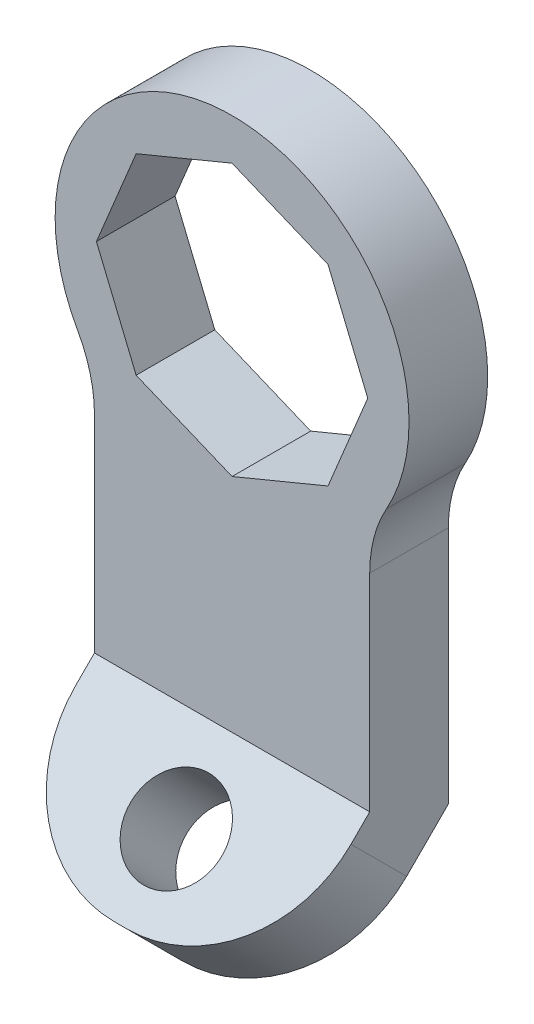
ISO-10303-21;
HEADER;
FILE_DESCRIPTION(('STEP AP214'),'2;1');
FILE_NAME('part.step','',(''),(''),'','','');
FILE_SCHEMA(('AUTOMOTIVE_DESIGN { 1 0 10303 214 1 1 1 1 }'));
ENDSEC;
DATA;
#1=APPLICATION_CONTEXT('core data for automotive mechanical design processes');
#2=APPLICATION_PROTOCOL_DEFINITION('international standard','automotive_design',2000,#1);
#3=PRODUCT_CONTEXT('',#1,'mechanical');
#4=PRODUCT('Part','Part','',(#3));
#5=PRODUCT_RELATED_PRODUCT_CATEGORY('part','',(#4));
#6=PRODUCT_DEFINITION_FORMATION('','',#4);
#7=PRODUCT_DEFINITION_CONTEXT('part definition',#1,'design');
#8=PRODUCT_DEFINITION('design','',#6,#7);
#9=PRODUCT_DEFINITION_SHAPE('','',#8);
#10=(LENGTH_UNIT() NAMED_UNIT(*) SI_UNIT(.MILLI.,.METRE.));
#11=(NAMED_UNIT(*) PLANE_ANGLE_UNIT() SI_UNIT($,.RADIAN.));
#12=(NAMED_UNIT(*) SI_UNIT($,.STERADIAN.) SOLID_ANGLE_UNIT());
#13=UNCERTAINTY_MEASURE_WITH_UNIT(LENGTH_MEASURE(1.E-05),#10,'distance_accuracy_value','');
#14=(GEOMETRIC_REPRESENTATION_CONTEXT(3) GLOBAL_UNCERTAINTY_ASSIGNED_CONTEXT((#13)) GLOBAL_UNIT_ASSIGNED_CONTEXT((#10,
#11,#12)) REPRESENTATION_CONTEXT('',''));
#15=CARTESIAN_POINT('',(0.,0.,0.));
#16=DIRECTION('',(0.,0.,1.));
#17=DIRECTION('',(1.,0.,0.));
#18=AXIS2_PLACEMENT_3D('',#15,#16,#17);
#19=CARTESIAN_POINT('',(0.,0.,0.));
#20=DIRECTION('',(0.,0.,1.));
#21=DIRECTION('',(1.,0.,0.));
#22=AXIS2_PLACEMENT_3D('',#19,#20,#21);
#23=PLANE('',#22);
#24=DIRECTION('',(0.38268343236509,-0.923879532511287,0.));
#25=VECTOR('',#24,1.);
#26=CARTESIAN_POINT('',(7.31855518528077,7.31855518528077,0.));
#27=LINE('',#26,#25);
#28=CARTESIAN_POINT('',(7.31855518528077,7.31855518528077,0.));
#29=VERTEX_POINT('',#28);
#30=CARTESIAN_POINT('',(10.35,0.,0.));
#31=VERTEX_POINT('',#30);
#32=EDGE_CURVE('E218',#29,#31,#27,.T.);
#33=ORIENTED_EDGE('',*,*,#32,.F.);
#34=DIRECTION('',(0.923879532511287,-0.38268343236509,0.));
#35=VECTOR('',#34,1.);
#36=CARTESIAN_POINT('',(0.,10.35,0.));
#37=LINE('',#36,#35);
#38=CARTESIAN_POINT('',(0.,10.35,0.));
#39=VERTEX_POINT('',#38);
#40=EDGE_CURVE('E219',#39,#29,#37,.T.);
#41=ORIENTED_EDGE('',*,*,#40,.F.);
#42=DIRECTION('',(0.923879532511287,0.38268343236509,0.));
#43=VECTOR('',#42,1.);
#44=CARTESIAN_POINT('',(-7.31855518528077,7.31855518528077,0.));
#45=LINE('',#44,#43);
#46=CARTESIAN_POINT('',(-7.31855518528077,7.31855518528077,0.));
#47=VERTEX_POINT('',#46);
#48=EDGE_CURVE('E232',#47,#39,#45,.T.);
#49=ORIENTED_EDGE('',*,*,#48,.F.);
#50=DIRECTION('',(0.38268343236509,0.923879532511287,0.));
#51=VECTOR('',#50,1.);
#52=CARTESIAN_POINT('',(-10.35,0.,0.));
#53=LINE('',#52,#51);
#54=CARTESIAN_POINT('',(-10.35,0.,0.));
#55=VERTEX_POINT('',#54);
#56=EDGE_CURVE('E272',#55,#47,#53,.T.);
#57=ORIENTED_EDGE('',*,*,#56,.F.);
#58=DIRECTION('',(-0.38268343236509,0.923879532511287,0.));
#59=VECTOR('',#58,1.);
#60=CARTESIAN_POINT('',(-7.31855518528077,-7.31855518528077,0.));
#61=LINE('',#60,#59);
#62=CARTESIAN_POINT('',(-7.31855518528077,-7.31855518528077,0.));
#63=VERTEX_POINT('',#62);
#64=EDGE_CURVE('E266',#63,#55,#61,.T.);
#65=ORIENTED_EDGE('',*,*,#64,.F.);
#66=DIRECTION('',(-0.923879532511287,0.38268343236509,0.));
#67=VECTOR('',#66,1.);
#68=CARTESIAN_POINT('',(0.,-10.35,0.));
#69=LINE('',#68,#67);
#70=CARTESIAN_POINT('',(0.,-10.35,0.));
#71=VERTEX_POINT('',#70);
#72=EDGE_CURVE('E263',#71,#63,#69,.T.);
#73=ORIENTED_EDGE('',*,*,#72,.F.);
#74=DIRECTION('',(-0.923879532511287,-0.38268343236509,0.));
#75=VECTOR('',#74,1.);
#76=CARTESIAN_POINT('',(7.31855518528077,-7.31855518528077,0.));
#77=LINE('',#76,#75);
#78=CARTESIAN_POINT('',(7.31855518528077,-7.31855518528077,0.));
#79=VERTEX_POINT('',#78);
#80=EDGE_CURVE('E265',#79,#71,#77,.T.);
#81=ORIENTED_EDGE('',*,*,#80,.F.);
#82=DIRECTION('',(-0.38268343236509,-0.923879532511287,0.));
#83=VECTOR('',#82,1.);
#84=CARTESIAN_POINT('',(10.35,0.,0.));
#85=LINE('',#84,#83);
#86=EDGE_CURVE('E256',#31,#79,#85,.T.);
#87=ORIENTED_EDGE('',*,*,#86,.F.);
#88=EDGE_LOOP('',(#33,#41,#49,#57,#65,#73,#81,#87));
#89=FACE_BOUND('',#88,.T.);
#90=DIRECTION('',(1.,0.,0.));
#91=VECTOR('',#90,1.);
#92=CARTESIAN_POINT('',(-13.5,-29.7426406871192,0.));
#93=LINE('',#92,#91);
#94=CARTESIAN_POINT('',(-10.5,-29.7426406871192,0.));
#95=VERTEX_POINT('',#94);
#96=CARTESIAN_POINT('',(10.5,-29.7426406871192,0.));
#97=VERTEX_POINT('',#96);
#98=EDGE_CURVE('E198',#95,#97,#93,.T.);
#99=ORIENTED_EDGE('',*,*,#98,.F.);
#100=DIRECTION('',(0.,1.,0.));
#101=VECTOR('',#100,1.);
#102=CARTESIAN_POINT('',(-10.5,0.,0.));
#103=LINE('',#102,#101);
#104=CARTESIAN_POINT('',(-10.5,-11.4891252930761,0.));
#105=VERTEX_POINT('',#104);
#106=EDGE_CURVE('E209',#95,#105,#103,.T.);
#107=ORIENTED_EDGE('',*,*,#106,.T.);
#108=CARTESIAN_POINT('',(-20.5,-11.4891252930761,0.));
#109=DIRECTION('',(0.,0.,1.));
#110=DIRECTION('',(1.,0.,0.));
#111=AXIS2_PLACEMENT_3D('',#108,#109,#110);
#112=CIRCLE('',#111,10.);
#113=CARTESIAN_POINT('',(-11.7765957446809,-6.60013580666071,0.));
#114=VERTEX_POINT('',#113);
#115=EDGE_CURVE('E323',#105,#114,#112,.T.);
#116=ORIENTED_EDGE('',*,*,#115,.T.);
#117=CARTESIAN_POINT('',(0.,0.,0.));
#118=DIRECTION('',(0.,0.,1.));
#119=DIRECTION('',(1.,0.,0.));
#120=AXIS2_PLACEMENT_3D('',#117,#118,#119);
#121=CIRCLE('',#120,13.5);
#122=CARTESIAN_POINT('',(11.7765957446809,-6.60013580666071,0.));
#123=VERTEX_POINT('',#122);
#124=EDGE_CURVE('E279',#123,#114,#121,.T.);
#125=ORIENTED_EDGE('',*,*,#124,.F.);
#126=CARTESIAN_POINT('',(20.5,-11.4891252930761,0.));
#127=DIRECTION('',(0.,0.,1.));
#128=DIRECTION('',(1.,0.,0.));
#129=AXIS2_PLACEMENT_3D('',#126,#127,#128);
#130=CIRCLE('',#129,10.);
#131=CARTESIAN_POINT('',(10.5,-11.4891252930761,0.));
#132=VERTEX_POINT('',#131);
#133=EDGE_CURVE('E12',#123,#132,#130,.T.);
#134=ORIENTED_EDGE('',*,*,#133,.T.);
#135=DIRECTION('',(0.,1.,0.));
#136=VECTOR('',#135,1.);
#137=CARTESIAN_POINT('',(10.5,0.,0.));
#138=LINE('',#137,#136);
#139=EDGE_CURVE('E212',#97,#132,#138,.T.);
#140=ORIENTED_EDGE('',*,*,#139,.F.);
#141=EDGE_LOOP('',(#99,#107,#116,#125,#134,#140));
#142=FACE_BOUND('',#141,.T.);
#143=ADVANCED_FACE('F68',(#89,#142),#23,.F.);
#144=CARTESIAN_POINT('',(-10.5,0.,0.));
#145=DIRECTION('',(1.,0.,0.));
#146=DIRECTION('',(0.,1.,0.));
#147=AXIS2_PLACEMENT_3D('',#144,#145,#146);
#148=PLANE('',#147);
#149=DIRECTION('',(0.,0.707106781186551,-0.707106781186544));
#150=VECTOR('',#149,1.);
#151=CARTESIAN_POINT('',(-10.5,-40.,10.2573593128807));
#152=LINE('',#151,#150);
#153=CARTESIAN_POINT('',(-10.5,-32.9289321881345,3.18629150101525));
#154=VERTEX_POINT('',#153);
#155=EDGE_CURVE('E193',#154,#95,#152,.T.);
#156=ORIENTED_EDGE('',*,*,#155,.F.);
#157=DIRECTION('',(0.,-0.707106781186545,-0.707106781186551));
#158=VECTOR('',#157,1.);
#159=CARTESIAN_POINT('',(-10.5,-28.6862915010152,7.42893218813455));
#160=LINE('',#159,#158);
#161=CARTESIAN_POINT('',(-10.5,-28.6862915010152,7.42893218813455));
#162=VERTEX_POINT('',#161);
#163=EDGE_CURVE('E310',#154,#162,#160,.F.);
#164=ORIENTED_EDGE('',*,*,#163,.T.);
#165=DIRECTION('',(0.,-0.707106781186551,0.707106781186544));
#166=VECTOR('',#165,1.);
#167=CARTESIAN_POINT('',(-10.5,-27.2573593128806,6.));
#168=LINE('',#167,#166);
#169=CARTESIAN_POINT('',(-10.5,-27.2573593128806,6.));
#170=VERTEX_POINT('',#169);
#171=EDGE_CURVE('E207',#170,#162,#168,.T.);
#172=ORIENTED_EDGE('',*,*,#171,.F.);
#173=DIRECTION('',(0.,1.,0.));
#174=VECTOR('',#173,1.);
#175=CARTESIAN_POINT('',(-10.5,0.,6.));
#176=LINE('',#175,#174);
#177=CARTESIAN_POINT('',(-10.5,-11.4891252930761,6.));
#178=VERTEX_POINT('',#177);
#179=EDGE_CURVE('E225',#170,#178,#176,.T.);
#180=ORIENTED_EDGE('',*,*,#179,.T.);
#181=DIRECTION('',(0.,0.,1.));
#182=VECTOR('',#181,1.);
#183=CARTESIAN_POINT('',(-10.5,-11.4891252930761,0.));
#184=LINE('',#183,#182);
#185=EDGE_CURVE('E220',#178,#105,#184,.F.);
#186=ORIENTED_EDGE('',*,*,#185,.T.);
#187=ORIENTED_EDGE('',*,*,#106,.F.);
#188=EDGE_LOOP('',(#156,#164,#172,#180,#186,#187));
#189=FACE_BOUND('',#188,.T.);
#190=ADVANCED_FACE('F211',(#189),#148,.F.);
#191=CARTESIAN_POINT('',(10.5,0.,0.));
#192=DIRECTION('',(1.,0.,0.));
#193=DIRECTION('',(0.,1.,0.));
#194=AXIS2_PLACEMENT_3D('',#191,#192,#193);
#195=PLANE('',#194);
#196=ORIENTED_EDGE('',*,*,#139,.T.);
#197=DIRECTION('',(0.,0.,-1.));
#198=VECTOR('',#197,1.);
#199=CARTESIAN_POINT('',(10.5,-11.4891252930761,0.));
#200=LINE('',#199,#198);
#201=CARTESIAN_POINT('',(10.5,-11.4891252930761,6.));
#202=VERTEX_POINT('',#201);
#203=EDGE_CURVE('E322',#132,#202,#200,.F.);
#204=ORIENTED_EDGE('',*,*,#203,.T.);
#205=DIRECTION('',(0.,1.,0.));
#206=VECTOR('',#205,1.);
#207=CARTESIAN_POINT('',(10.5,0.,6.));
#208=LINE('',#207,#206);
#209=CARTESIAN_POINT('',(10.5,-27.2573593128806,6.));
#210=VERTEX_POINT('',#209);
#211=EDGE_CURVE('E228',#210,#202,#208,.T.);
#212=ORIENTED_EDGE('',*,*,#211,.F.);
#213=DIRECTION('',(0.,-0.707106781186551,0.707106781186544));
#214=VECTOR('',#213,1.);
#215=CARTESIAN_POINT('',(10.5,-27.2573593128806,6.));
#216=LINE('',#215,#214);
#217=CARTESIAN_POINT('',(10.5,-28.6862915010152,7.42893218813456));
#218=VERTEX_POINT('',#217);
#219=EDGE_CURVE('E342',#210,#218,#216,.T.);
#220=ORIENTED_EDGE('',*,*,#219,.T.);
#221=DIRECTION('',(0.,-0.707106781186545,-0.707106781186551));
#222=VECTOR('',#221,1.);
#223=CARTESIAN_POINT('',(10.5,-18.057611844575,18.0576118445749));
#224=LINE('',#223,#222);
#225=CARTESIAN_POINT('',(10.5,-32.9289321881345,3.18629150101525));
#226=VERTEX_POINT('',#225);
#227=EDGE_CURVE('E319',#218,#226,#224,.T.);
#228=ORIENTED_EDGE('',*,*,#227,.T.);
#229=DIRECTION('',(0.,0.707106781186551,-0.707106781186544));
#230=VECTOR('',#229,1.);
#231=CARTESIAN_POINT('',(10.5,-40.,10.2573593128807));
#232=LINE('',#231,#230);
#233=EDGE_CURVE('E339',#226,#97,#232,.T.);
#234=ORIENTED_EDGE('',*,*,#233,.T.);
#235=EDGE_LOOP('',(#196,#204,#212,#220,#228,#234));
#236=FACE_BOUND('',#235,.T.);
#237=ADVANCED_FACE('F337',(#236),#195,.T.);
#238=CARTESIAN_POINT('',(0.,0.,6.));
#239=DIRECTION('',(0.,0.,-1.));
#240=DIRECTION('',(-1.,0.,0.));
#241=AXIS2_PLACEMENT_3D('',#238,#239,#240);
#242=CYLINDRICAL_SURFACE('',#241,13.5);
#243=ORIENTED_EDGE('',*,*,#124,.T.);
#244=DIRECTION('',(0.,0.,-1.));
#245=VECTOR('',#244,1.);
#246=CARTESIAN_POINT('',(-11.7765957446809,-6.60013580666071,6.));
#247=LINE('',#246,#245);
#248=CARTESIAN_POINT('',(-11.7765957446809,-6.60013580666071,6.));
#249=VERTEX_POINT('',#248);
#250=EDGE_CURVE('E314',#114,#249,#247,.F.);
#251=ORIENTED_EDGE('',*,*,#250,.T.);
#252=CARTESIAN_POINT('',(0.,0.,6.));
#253=DIRECTION('',(0.,0.,1.));
#254=DIRECTION('',(1.,0.,0.));
#255=AXIS2_PLACEMENT_3D('',#252,#253,#254);
#256=CIRCLE('',#255,13.5);
#257=CARTESIAN_POINT('',(11.7765957446809,-6.60013580666071,6.));
#258=VERTEX_POINT('',#257);
#259=EDGE_CURVE('E291',#258,#249,#256,.T.);
#260=ORIENTED_EDGE('',*,*,#259,.F.);
#261=DIRECTION('',(0.,0.,-1.));
#262=VECTOR('',#261,1.);
#263=CARTESIAN_POINT('',(11.7765957446809,-6.60013580666071,6.));
#264=LINE('',#263,#262);
#265=EDGE_CURVE('E312',#258,#123,#264,.T.);
#266=ORIENTED_EDGE('',*,*,#265,.T.);
#267=EDGE_LOOP('',(#243,#251,#260,#266));
#268=FACE_BOUND('',#267,.T.);
#269=ADVANCED_FACE('F335',(#268),#242,.T.);
#270=CARTESIAN_POINT('',(0.,0.,6.));
#271=DIRECTION('',(0.,0.,1.));
#272=DIRECTION('',(1.,0.,0.));
#273=AXIS2_PLACEMENT_3D('',#270,#271,#272);
#274=PLANE('',#273);
#275=DIRECTION('',(1.,0.,0.));
#276=VECTOR('',#275,1.);
#277=CARTESIAN_POINT('',(-10.5,-27.2573593128806,6.));
#278=LINE('',#277,#276);
#279=EDGE_CURVE('E202',#170,#210,#278,.T.);
#280=ORIENTED_EDGE('',*,*,#279,.T.);
#281=ORIENTED_EDGE('',*,*,#211,.T.);
#282=CARTESIAN_POINT('',(20.5,-11.4891252930761,6.));
#283=DIRECTION('',(0.,0.,1.));
#284=DIRECTION('',(1.,0.,0.));
#285=AXIS2_PLACEMENT_3D('',#282,#283,#284);
#286=CIRCLE('',#285,10.);
#287=EDGE_CURVE('E76',#202,#258,#286,.F.);
#288=ORIENTED_EDGE('',*,*,#287,.T.);
#289=ORIENTED_EDGE('',*,*,#259,.T.);
#290=CARTESIAN_POINT('',(-20.5,-11.4891252930761,6.));
#291=DIRECTION('',(0.,0.,1.));
#292=DIRECTION('',(1.,0.,0.));
#293=AXIS2_PLACEMENT_3D('',#290,#291,#292);
#294=CIRCLE('',#293,10.);
#295=EDGE_CURVE('E324',#249,#178,#294,.F.);
#296=ORIENTED_EDGE('',*,*,#295,.T.);
#297=ORIENTED_EDGE('',*,*,#179,.F.);
#298=EDGE_LOOP('',(#280,#281,#288,#289,#296,#297));
#299=FACE_BOUND('',#298,.T.);
#300=DIRECTION('',(0.923879532511287,-0.38268343236509,0.));
#301=VECTOR('',#300,1.);
#302=CARTESIAN_POINT('',(0.,10.35,6.));
#303=LINE('',#302,#301);
#304=CARTESIAN_POINT('',(0.,10.35,6.));
#305=VERTEX_POINT('',#304);
#306=CARTESIAN_POINT('',(7.31855518528077,7.31855518528077,6.));
#307=VERTEX_POINT('',#306);
#308=EDGE_CURVE('E233',#305,#307,#303,.T.);
#309=ORIENTED_EDGE('',*,*,#308,.T.);
#310=DIRECTION('',(0.38268343236509,-0.923879532511287,0.));
#311=VECTOR('',#310,1.);
#312=CARTESIAN_POINT('',(7.31855518528077,7.31855518528077,6.));
#313=LINE('',#312,#311);
#314=CARTESIAN_POINT('',(10.35,0.,6.));
#315=VERTEX_POINT('',#314);
#316=EDGE_CURVE('E234',#307,#315,#313,.T.);
#317=ORIENTED_EDGE('',*,*,#316,.T.);
#318=DIRECTION('',(-0.38268343236509,-0.923879532511287,0.));
#319=VECTOR('',#318,1.);
#320=CARTESIAN_POINT('',(10.35,0.,6.));
#321=LINE('',#320,#319);
#322=CARTESIAN_POINT('',(7.31855518528077,-7.31855518528077,6.));
#323=VERTEX_POINT('',#322);
#324=EDGE_CURVE('E238',#315,#323,#321,.T.);
#325=ORIENTED_EDGE('',*,*,#324,.T.);
#326=DIRECTION('',(-0.923879532511287,-0.38268343236509,0.));
#327=VECTOR('',#326,1.);
#328=CARTESIAN_POINT('',(7.31855518528077,-7.31855518528077,6.));
#329=LINE('',#328,#327);
#330=CARTESIAN_POINT('',(0.,-10.35,6.));
#331=VERTEX_POINT('',#330);
#332=EDGE_CURVE('E241',#323,#331,#329,.T.);
#333=ORIENTED_EDGE('',*,*,#332,.T.);
#334=DIRECTION('',(-0.923879532511287,0.38268343236509,0.));
#335=VECTOR('',#334,1.);
#336=CARTESIAN_POINT('',(0.,-10.35,6.));
#337=LINE('',#336,#335);
#338=CARTESIAN_POINT('',(-7.31855518528077,-7.31855518528077,6.));
#339=VERTEX_POINT('',#338);
#340=EDGE_CURVE('E242',#331,#339,#337,.T.);
#341=ORIENTED_EDGE('',*,*,#340,.T.);
#342=DIRECTION('',(-0.38268343236509,0.923879532511287,0.));
#343=VECTOR('',#342,1.);
#344=CARTESIAN_POINT('',(-7.31855518528077,-7.31855518528077,6.));
#345=LINE('',#344,#343);
#346=CARTESIAN_POINT('',(-10.35,0.,6.));
#347=VERTEX_POINT('',#346);
#348=EDGE_CURVE('E250',#339,#347,#345,.T.);
#349=ORIENTED_EDGE('',*,*,#348,.T.);
#350=DIRECTION('',(0.38268343236509,0.923879532511287,0.));
#351=VECTOR('',#350,1.);
#352=CARTESIAN_POINT('',(-10.35,0.,6.));
#353=LINE('',#352,#351);
#354=CARTESIAN_POINT('',(-7.31855518528077,7.31855518528077,6.));
#355=VERTEX_POINT('',#354);
#356=EDGE_CURVE('E249',#347,#355,#353,.T.);
#357=ORIENTED_EDGE('',*,*,#356,.T.);
#358=DIRECTION('',(0.923879532511287,0.38268343236509,0.));
#359=VECTOR('',#358,1.);
#360=CARTESIAN_POINT('',(-7.31855518528077,7.31855518528077,6.));
#361=LINE('',#360,#359);
#362=EDGE_CURVE('E254',#355,#305,#361,.T.);
#363=ORIENTED_EDGE('',*,*,#362,.T.);
#364=EDGE_LOOP('',(#309,#317,#325,#333,#341,#349,#357,#363));
#365=FACE_BOUND('',#364,.T.);
#366=ADVANCED_FACE('F329',(#299,#365),#274,.T.);
#367=CARTESIAN_POINT('',(0.,10.35,6.));
#368=DIRECTION('',(0.38268343236509,0.923879532511287,0.));
#369=DIRECTION('',(-0.923879532511287,0.38268343236509,0.));
#370=AXIS2_PLACEMENT_3D('',#367,#368,#369);
#371=PLANE('',#370);
#372=ORIENTED_EDGE('',*,*,#40,.T.);
#373=DIRECTION('',(0.,0.,-1.));
#374=VECTOR('',#373,1.);
#375=CARTESIAN_POINT('',(7.31855518528077,7.31855518528077,6.));
#376=LINE('',#375,#374);
#377=EDGE_CURVE('E253',#307,#29,#376,.T.);
#378=ORIENTED_EDGE('',*,*,#377,.F.);
#379=ORIENTED_EDGE('',*,*,#308,.F.);
#380=DIRECTION('',(0.,0.,-1.));
#381=VECTOR('',#380,1.);
#382=CARTESIAN_POINT('',(0.,10.35,6.));
#383=LINE('',#382,#381);
#384=EDGE_CURVE('E277',#305,#39,#383,.T.);
#385=ORIENTED_EDGE('',*,*,#384,.T.);
#386=EDGE_LOOP('',(#372,#378,#379,#385));
#387=FACE_BOUND('',#386,.T.);
#388=ADVANCED_FACE('F535',(#387),#371,.F.);
#389=CARTESIAN_POINT('',(-7.31855518528077,7.31855518528077,6.));
#390=DIRECTION('',(-0.38268343236509,0.923879532511287,0.));
#391=DIRECTION('',(-0.923879532511287,-0.38268343236509,0.));
#392=AXIS2_PLACEMENT_3D('',#389,#390,#391);
#393=PLANE('',#392);
#394=ORIENTED_EDGE('',*,*,#48,.T.);
#395=ORIENTED_EDGE('',*,*,#384,.F.);
#396=ORIENTED_EDGE('',*,*,#362,.F.);
#397=DIRECTION('',(0.,0.,-1.));
#398=VECTOR('',#397,1.);
#399=CARTESIAN_POINT('',(-7.31855518528077,7.31855518528077,6.));
#400=LINE('',#399,#398);
#401=EDGE_CURVE('E276',#355,#47,#400,.T.);
#402=ORIENTED_EDGE('',*,*,#401,.T.);
#403=EDGE_LOOP('',(#394,#395,#396,#402));
#404=FACE_BOUND('',#403,.T.);
#405=ADVANCED_FACE('F524',(#404),#393,.F.);
#406=CARTESIAN_POINT('',(-10.35,0.,6.));
#407=DIRECTION('',(-0.923879532511287,0.38268343236509,0.));
#408=DIRECTION('',(-0.38268343236509,-0.923879532511287,0.));
#409=AXIS2_PLACEMENT_3D('',#406,#407,#408);
#410=PLANE('',#409);
#411=ORIENTED_EDGE('',*,*,#56,.T.);
#412=ORIENTED_EDGE('',*,*,#401,.F.);
#413=ORIENTED_EDGE('',*,*,#356,.F.);
#414=DIRECTION('',(0.,0.,-1.));
#415=VECTOR('',#414,1.);
#416=CARTESIAN_POINT('',(-10.35,0.,6.));
#417=LINE('',#416,#415);
#418=EDGE_CURVE('E282',#347,#55,#417,.T.);
#419=ORIENTED_EDGE('',*,*,#418,.T.);
#420=EDGE_LOOP('',(#411,#412,#413,#419));
#421=FACE_BOUND('',#420,.T.);
#422=ADVANCED_FACE('F511',(#421),#410,.F.);
#423=CARTESIAN_POINT('',(-7.31855518528077,-7.31855518528077,6.));
#424=DIRECTION('',(-0.923879532511287,-0.38268343236509,0.));
#425=DIRECTION('',(0.38268343236509,-0.923879532511287,0.));
#426=AXIS2_PLACEMENT_3D('',#423,#424,#425);
#427=PLANE('',#426);
#428=ORIENTED_EDGE('',*,*,#64,.T.);
#429=ORIENTED_EDGE('',*,*,#418,.F.);
#430=ORIENTED_EDGE('',*,*,#348,.F.);
#431=DIRECTION('',(0.,0.,-1.));
#432=VECTOR('',#431,1.);
#433=CARTESIAN_POINT('',(-7.31855518528077,-7.31855518528077,6.));
#434=LINE('',#433,#432);
#435=EDGE_CURVE('E284',#339,#63,#434,.T.);
#436=ORIENTED_EDGE('',*,*,#435,.T.);
#437=EDGE_LOOP('',(#428,#429,#430,#436));
#438=FACE_BOUND('',#437,.T.);
#439=ADVANCED_FACE('F504',(#438),#427,.F.);
#440=CARTESIAN_POINT('',(0.,-10.35,6.));
#441=DIRECTION('',(-0.38268343236509,-0.923879532511287,0.));
#442=DIRECTION('',(0.923879532511287,-0.38268343236509,0.));
#443=AXIS2_PLACEMENT_3D('',#440,#441,#442);
#444=PLANE('',#443);
#445=ORIENTED_EDGE('',*,*,#72,.T.);
#446=ORIENTED_EDGE('',*,*,#435,.F.);
#447=ORIENTED_EDGE('',*,*,#340,.F.);
#448=DIRECTION('',(0.,0.,-1.));
#449=VECTOR('',#448,1.);
#450=CARTESIAN_POINT('',(0.,-10.35,6.));
#451=LINE('',#450,#449);
#452=EDGE_CURVE('E283',#331,#71,#451,.T.);
#453=ORIENTED_EDGE('',*,*,#452,.T.);
#454=EDGE_LOOP('',(#445,#446,#447,#453));
#455=FACE_BOUND('',#454,.T.);
#456=ADVANCED_FACE('F496',(#455),#444,.F.);
#457=CARTESIAN_POINT('',(7.31855518528077,-7.31855518528077,6.));
#458=DIRECTION('',(0.38268343236509,-0.923879532511287,0.));
#459=DIRECTION('',(0.923879532511287,0.38268343236509,0.));
#460=AXIS2_PLACEMENT_3D('',#457,#458,#459);
#461=PLANE('',#460);
#462=ORIENTED_EDGE('',*,*,#80,.T.);
#463=ORIENTED_EDGE('',*,*,#452,.F.);
#464=ORIENTED_EDGE('',*,*,#332,.F.);
#465=DIRECTION('',(0.,0.,-1.));
#466=VECTOR('',#465,1.);
#467=CARTESIAN_POINT('',(7.31855518528077,-7.31855518528077,6.));
#468=LINE('',#467,#466);
#469=EDGE_CURVE('E290',#323,#79,#468,.T.);
#470=ORIENTED_EDGE('',*,*,#469,.T.);
#471=EDGE_LOOP('',(#462,#463,#464,#470));
#472=FACE_BOUND('',#471,.T.);
#473=ADVANCED_FACE('F487',(#472),#461,.F.);
#474=CARTESIAN_POINT('',(10.35,0.,6.));
#475=DIRECTION('',(0.923879532511287,-0.38268343236509,0.));
#476=DIRECTION('',(0.38268343236509,0.923879532511287,0.));
#477=AXIS2_PLACEMENT_3D('',#474,#475,#476);
#478=PLANE('',#477);
#479=ORIENTED_EDGE('',*,*,#86,.T.);
#480=ORIENTED_EDGE('',*,*,#469,.F.);
#481=ORIENTED_EDGE('',*,*,#324,.F.);
#482=DIRECTION('',(0.,0.,-1.));
#483=VECTOR('',#482,1.);
#484=CARTESIAN_POINT('',(10.35,0.,6.));
#485=LINE('',#484,#483);
#486=EDGE_CURVE('E289',#315,#31,#485,.T.);
#487=ORIENTED_EDGE('',*,*,#486,.T.);
#488=EDGE_LOOP('',(#479,#480,#481,#487));
#489=FACE_BOUND('',#488,.T.);
#490=ADVANCED_FACE('F479',(#489),#478,.F.);
#491=CARTESIAN_POINT('',(7.31855518528077,7.31855518528077,6.));
#492=DIRECTION('',(0.923879532511287,0.38268343236509,0.));
#493=DIRECTION('',(-0.38268343236509,0.923879532511287,0.));
#494=AXIS2_PLACEMENT_3D('',#491,#492,#493);
#495=PLANE('',#494);
#496=ORIENTED_EDGE('',*,*,#32,.T.);
#497=ORIENTED_EDGE('',*,*,#486,.F.);
#498=ORIENTED_EDGE('',*,*,#316,.F.);
#499=ORIENTED_EDGE('',*,*,#377,.T.);
#500=EDGE_LOOP('',(#496,#497,#498,#499));
#501=FACE_BOUND('',#500,.T.);
#502=ADVANCED_FACE('F463',(#501),#495,.F.);
#503=CARTESIAN_POINT('',(-10.5,-40.,10.2573593128807));
#504=DIRECTION('',(0.,-0.707106781186544,-0.707106781186551));
#505=DIRECTION('',(0.,0.707106781186551,-0.707106781186544));
#506=AXIS2_PLACEMENT_3D('',#503,#504,#505);
#507=PLANE('',#506);
#508=CARTESIAN_POINT('',(0.,-35.7573593128807,6.01471862576143));
#509=DIRECTION('',(0.,-0.707106781186544,-0.707106781186551));
#510=DIRECTION('',(0.,0.707106781186551,-0.707106781186544));
#511=AXIS2_PLACEMENT_3D('',#508,#509,#510);
#512=CIRCLE('',#511,3.5);
#513=CARTESIAN_POINT('',(0.,-38.2322330470336,8.48959235991433));
#514=VERTEX_POINT('',#513);
#515=EDGE_CURVE('E343',#514,#514,#512,.T.);
#516=ORIENTED_EDGE('',*,*,#515,.F.);
#517=EDGE_LOOP('',(#516));
#518=FACE_BOUND('',#517,.T.);
#519=DIRECTION('',(1.,0.,0.));
#520=VECTOR('',#519,1.);
#521=CARTESIAN_POINT('',(-10.5,-40.,10.2573593128807));
#522=LINE('',#521,#520);
#523=CARTESIAN_POINT('',(-0.500000000000002,-40.,10.2573593128807));
#524=VERTEX_POINT('',#523);
#525=CARTESIAN_POINT('',(0.499999999999999,-40.,10.2573593128807));
#526=VERTEX_POINT('',#525);
#527=EDGE_CURVE('E230',#524,#526,#522,.T.);
#528=ORIENTED_EDGE('',*,*,#527,.F.);
#529=CARTESIAN_POINT('',(-0.499999999999999,-32.9289321881345,3.18629150101525));
#530=DIRECTION('',(0.,-0.707106781186544,-0.707106781186551));
#531=DIRECTION('',(0.,0.707106781186551,-0.707106781186544));
#532=AXIS2_PLACEMENT_3D('',#529,#530,#531);
#533=CIRCLE('',#532,10.);
#534=EDGE_CURVE('E203',#524,#154,#533,.T.);
#535=ORIENTED_EDGE('',*,*,#534,.T.);
#536=ORIENTED_EDGE('',*,*,#155,.T.);
#537=ORIENTED_EDGE('',*,*,#98,.T.);
#538=ORIENTED_EDGE('',*,*,#233,.F.);
#539=CARTESIAN_POINT('',(0.500000000000002,-32.9289321881345,3.18629150101525));
#540=DIRECTION('',(0.,-0.707106781186544,-0.707106781186551));
#541=DIRECTION('',(0.,0.707106781186551,-0.707106781186544));
#542=AXIS2_PLACEMENT_3D('',#539,#540,#541);
#543=CIRCLE('',#542,10.);
#544=EDGE_CURVE('E303',#226,#526,#543,.T.);
#545=ORIENTED_EDGE('',*,*,#544,.T.);
#546=EDGE_LOOP('',(#528,#535,#536,#537,#538,#545));
#547=FACE_BOUND('',#546,.T.);
#548=ADVANCED_FACE('F199',(#518,#547),#507,.T.);
#549=CARTESIAN_POINT('',(-10.5,-35.7573593128807,14.5));
#550=DIRECTION('',(0.,-0.70710678118655,0.707106781186544));
#551=DIRECTION('',(0.,-0.707106781186545,-0.707106781186551));
#552=AXIS2_PLACEMENT_3D('',#549,#550,#551);
#553=PLANE('',#552);
#554=DIRECTION('',(1.,0.,0.));
#555=VECTOR('',#554,1.);
#556=CARTESIAN_POINT('',(-10.5,-35.7573593128807,14.5));
#557=LINE('',#556,#555);
#558=CARTESIAN_POINT('',(-0.500000000000002,-35.7573593128807,14.5));
#559=VERTEX_POINT('',#558);
#560=CARTESIAN_POINT('',(0.499999999999999,-35.7573593128807,14.5));
#561=VERTEX_POINT('',#560);
#562=EDGE_CURVE('E348',#559,#561,#557,.T.);
#563=ORIENTED_EDGE('',*,*,#562,.F.);
#564=DIRECTION('',(0.,-0.707106781186545,-0.707106781186551));
#565=VECTOR('',#564,1.);
#566=CARTESIAN_POINT('',(-0.499999999999999,-40.,10.2573593128807));
#567=LINE('',#566,#565);
#568=EDGE_CURVE('E297',#559,#524,#567,.T.);
#569=ORIENTED_EDGE('',*,*,#568,.T.);
#570=ORIENTED_EDGE('',*,*,#527,.T.);
#571=DIRECTION('',(0.,-0.707106781186545,-0.707106781186551));
#572=VECTOR('',#571,1.);
#573=CARTESIAN_POINT('',(0.500000000000002,-35.7573593128807,14.5));
#574=LINE('',#573,#572);
#575=EDGE_CURVE('E298',#526,#561,#574,.F.);
#576=ORIENTED_EDGE('',*,*,#575,.T.);
#577=EDGE_LOOP('',(#563,#569,#570,#576));
#578=FACE_BOUND('',#577,.T.);
#579=ADVANCED_FACE('F361',(#578),#553,.T.);
#580=CARTESIAN_POINT('',(-10.5,-27.2573593128806,6.));
#581=DIRECTION('',(0.,0.707106781186544,0.707106781186551));
#582=DIRECTION('',(0.,-0.707106781186551,0.707106781186544));
#583=AXIS2_PLACEMENT_3D('',#580,#581,#582);
#584=PLANE('',#583);
#585=CARTESIAN_POINT('',(0.,-31.5147186257614,10.2573593128807));
#586=DIRECTION('',(0.,0.707106781186544,0.707106781186551));
#587=DIRECTION('',(0.,-0.707106781186551,0.707106781186544));
#588=AXIS2_PLACEMENT_3D('',#585,#586,#587);
#589=CIRCLE('',#588,3.5);
#590=CARTESIAN_POINT('',(0.,-33.9895923599144,12.7322330470336));
#591=VERTEX_POINT('',#590);
#592=EDGE_CURVE('E215',#591,#591,#589,.T.);
#593=ORIENTED_EDGE('',*,*,#592,.F.);
#594=EDGE_LOOP('',(#593));
#595=FACE_BOUND('',#594,.T.);
#596=ORIENTED_EDGE('',*,*,#171,.T.);
#597=CARTESIAN_POINT('',(-0.499999999999999,-28.6862915010152,7.42893218813455));
#598=DIRECTION('',(0.,0.707106781186544,0.707106781186551));
#599=DIRECTION('',(0.,-0.707106781186551,0.707106781186544));
#600=AXIS2_PLACEMENT_3D('',#597,#598,#599);
#601=CIRCLE('',#600,10.);
#602=EDGE_CURVE('E311',#162,#559,#601,.T.);
#603=ORIENTED_EDGE('',*,*,#602,.T.);
#604=ORIENTED_EDGE('',*,*,#562,.T.);
#605=CARTESIAN_POINT('',(0.500000000000002,-28.6862915010152,7.42893218813455));
#606=DIRECTION('',(0.,0.707106781186544,0.707106781186551));
#607=DIRECTION('',(0.,-0.707106781186551,0.707106781186544));
#608=AXIS2_PLACEMENT_3D('',#605,#606,#607);
#609=CIRCLE('',#608,10.);
#610=EDGE_CURVE('E307',#561,#218,#609,.T.);
#611=ORIENTED_EDGE('',*,*,#610,.T.);
#612=ORIENTED_EDGE('',*,*,#219,.F.);
#613=ORIENTED_EDGE('',*,*,#279,.F.);
#614=EDGE_LOOP('',(#596,#603,#604,#611,#612,#613));
#615=FACE_BOUND('',#614,.T.);
#616=ADVANCED_FACE('F352',(#595,#615),#584,.T.);
#617=CARTESIAN_POINT('',(0.,-40.886038969321,0.886038969321025));
#618=DIRECTION('',(0.,0.707106781186544,0.707106781186551));
#619=DIRECTION('',(0.,-0.707106781186551,0.707106781186544));
#620=AXIS2_PLACEMENT_3D('',#617,#618,#619);
#621=CYLINDRICAL_SURFACE('',#620,3.5);
#622=CARTESIAN_POINT('',(0.,-38.2322330470336,8.48959235991433));
#623=CARTESIAN_POINT('',(0.,-38.1880388732095,8.53378653373849));
#624=CARTESIAN_POINT('',(0.,-38.1438446993853,8.57798070756265));
#625=CARTESIAN_POINT('',(0.,-38.055456351737,8.66636905521097));
#626=CARTESIAN_POINT('',(0.,-38.0112621779128,8.71056322903513));
#627=CARTESIAN_POINT('',(0.,-37.9228738302645,8.79895157668344));
#628=CARTESIAN_POINT('',(0.,-37.8786796564404,8.8431457505076));
#629=CARTESIAN_POINT('',(0.,-37.790291308792,8.93153409815592));
#630=CARTESIAN_POINT('',(0.,-37.7460971349679,8.97572827198008));
#631=CARTESIAN_POINT('',(0.,-37.6577087873196,9.0641166196284));
#632=CARTESIAN_POINT('',(0.,-37.6135146134954,9.10831079345256));
#633=CARTESIAN_POINT('',(0.,-37.5251262658471,9.19669914110088));
#634=CARTESIAN_POINT('',(0.,-37.4809320920229,9.24089331492504));
#635=CARTESIAN_POINT('',(0.,-37.3925437443746,9.32928166257336));
#636=CARTESIAN_POINT('',(0.,-37.3483495705504,9.37347583639751));
#637=CARTESIAN_POINT('',(0.,-37.2599612229021,9.46186418404583));
#638=CARTESIAN_POINT('',(0.,-37.215767049078,9.50605835787));
#639=CARTESIAN_POINT('',(0.,-37.1273787014296,9.59444670551831));
#640=CARTESIAN_POINT('',(0.,-37.0831845276055,9.63864087934247));
#641=CARTESIAN_POINT('',(0.,-36.9947961799572,9.72702922699079));
#642=CARTESIAN_POINT('',(0.,-36.950602006133,9.77122340081495));
#643=CARTESIAN_POINT('',(0.,-36.8622136584847,9.85961174846327));
#644=CARTESIAN_POINT('',(0.,-36.8180194846605,9.90380592228743));
#645=CARTESIAN_POINT('',(0.,-36.7296311370122,9.99219426993575));
#646=CARTESIAN_POINT('',(0.,-36.6854369631881,10.0363884437599));
#647=CARTESIAN_POINT('',(0.,-36.5970486155397,10.1247767914082));
#648=CARTESIAN_POINT('',(0.,-36.5528544417156,10.1689709652324));
#649=CARTESIAN_POINT('',(0.,-36.4644660940673,10.2573593128807));
#650=CARTESIAN_POINT('',(0.,-36.4202719202431,10.3015534867049));
#651=CARTESIAN_POINT('',(0.,-36.3318835725948,10.3899418343532));
#652=CARTESIAN_POINT('',(0.,-36.2876893987706,10.4341360081773));
#653=CARTESIAN_POINT('',(0.,-36.1993010511223,10.5225243558257));
#654=CARTESIAN_POINT('',(0.,-36.1551068772982,10.5667185296498));
#655=CARTESIAN_POINT('',(0.,-36.0667185296498,10.6551068772981));
#656=CARTESIAN_POINT('',(0.,-36.0225243558257,10.6993010511223));
#657=CARTESIAN_POINT('',(0.,-35.9341360081774,10.7876893987706));
#658=CARTESIAN_POINT('',(0.,-35.8899418343532,10.8318835725948));
#659=CARTESIAN_POINT('',(0.,-35.8015534867049,10.9202719202431));
#660=CARTESIAN_POINT('',(0.,-35.7573593128807,10.9644660940673));
#661=CARTESIAN_POINT('',(0.,-35.6689709652324,11.0528544417156));
#662=CARTESIAN_POINT('',(0.,-35.6247767914083,11.0970486155397));
#663=CARTESIAN_POINT('',(0.,-35.5363884437599,11.1854369631881));
#664=CARTESIAN_POINT('',(0.,-35.4921942699358,11.2296311370122));
#665=CARTESIAN_POINT('',(0.,-35.4038059222875,11.3180194846605));
#666=CARTESIAN_POINT('',(0.,-35.3596117484633,11.3622136584847));
#667=CARTESIAN_POINT('',(0.,-35.271223400815,11.450602006133));
#668=CARTESIAN_POINT('',(0.,-35.2270292269908,11.4947961799572));
#669=CARTESIAN_POINT('',(0.,-35.1386408793425,11.5831845276055));
#670=CARTESIAN_POINT('',(0.,-35.0944467055183,11.6273787014296));
#671=CARTESIAN_POINT('',(0.,-35.00605835787,11.715767049078));
#672=CARTESIAN_POINT('',(0.,-34.9618641840459,11.7599612229021));
#673=CARTESIAN_POINT('',(0.,-34.8734758363975,11.8483495705504));
#674=CARTESIAN_POINT('',(0.,-34.8292816625734,11.8925437443746));
#675=CARTESIAN_POINT('',(0.,-34.7408933149251,11.9809320920229));
#676=CARTESIAN_POINT('',(0.,-34.6966991411009,12.0251262658471));
#677=CARTESIAN_POINT('',(0.,-34.6083107934526,12.1135146134954));
#678=CARTESIAN_POINT('',(0.,-34.5641166196284,12.1577087873196));
#679=CARTESIAN_POINT('',(0.,-34.4757282719801,12.2460971349679));
#680=CARTESIAN_POINT('',(0.,-34.431534098156,12.290291308792));
#681=CARTESIAN_POINT('',(0.,-34.3431457505076,12.3786796564404));
#682=CARTESIAN_POINT('',(0.,-34.2989515766835,12.4228738302645));
#683=CARTESIAN_POINT('',(0.,-34.2105632290352,12.5112621779128));
#684=CARTESIAN_POINT('',(0.,-34.166369055211,12.555456351737));
#685=CARTESIAN_POINT('',(0.,-34.0779807075627,12.6438446993853));
#686=CARTESIAN_POINT('',(0.,-34.0337865337385,12.6880388732095));
#687=CARTESIAN_POINT('',(0.,-33.9895923599144,12.7322330470336));
#688=B_SPLINE_CURVE_WITH_KNOTS('',3,(#622,#623,#624,#625,#626,#627,#628,#629,#630,#631,#632,
#633,#634,#635,#636,#637,#638,#639,#640,#641,#642,#643,#644,#645,#646,#647,#648,#649,#650,#651,
#652,#653,#654,#655,#656,#657,#658,#659,#660,#661,#662,#663,#664,#665,#666,#667,#668,#669,#670,
#671,#672,#673,#674,#675,#676,#677,#678,#679,#680,#681,#682,#683,#684,#685,#686,#687),
.UNSPECIFIED.,.F.,.F.,(4,2,2,2,2,2,2,2,2,2,2,2,2,2,2,2,2,2,2,2,2,2,2,2,2,2,2,2,2,2,2,2,4),(0.,
0.187499999999999,0.375000000000002,0.562500000000002,0.750000000000001,0.937499999999999,1.125,
1.3125,1.5,1.6875,1.875,2.0625,2.24999999999999,2.43749999999999,2.625,2.8125,2.99999999999999,
3.18749999999999,3.37499999999999,3.5625,3.74999999999999,3.93749999999999,4.12499999999999,
4.31249999999999,4.49999999999999,4.68749999999999,4.87499999999999,5.06249999999999,
5.24999999999999,5.43749999999999,5.62499999999999,5.81249999999999,5.99999999999999),.UNSPECIFIED.);
#689=EDGE_CURVE('BSEAM390',#514,#591,#688,.T.);
#690=ORIENTED_EDGE('',*,*,#515,.T.);
#691=ORIENTED_EDGE('',*,*,#592,.T.);
#692=ORIENTED_EDGE('',*,*,#689,.T.);
#693=ORIENTED_EDGE('',*,*,#689,.F.);
#694=EDGE_LOOP('',(#690,#692,#691,#693));
#695=FACE_BOUND('',#694,.T.);
#696=ADVANCED_FACE('F390',(#695),#621,.F.);
#697=CARTESIAN_POINT('',(-0.499999999999999,-28.6862915010152,7.42893218813455));
#698=DIRECTION('',(0.,0.707106781186545,0.707106781186551));
#699=DIRECTION('',(0.,-0.707106781186551,0.707106781186545));
#700=AXIS2_PLACEMENT_3D('',#697,#698,#699);
#701=CYLINDRICAL_SURFACE('',#700,10.);
#702=ORIENTED_EDGE('',*,*,#602,.F.);
#703=ORIENTED_EDGE('',*,*,#163,.F.);
#704=ORIENTED_EDGE('',*,*,#534,.F.);
#705=ORIENTED_EDGE('',*,*,#568,.F.);
#706=EDGE_LOOP('',(#702,#703,#704,#705));
#707=FACE_BOUND('',#706,.T.);
#708=ADVANCED_FACE('F356',(#707),#701,.T.);
#709=CARTESIAN_POINT('',(-20.5,-11.4891252930761,6.));
#710=DIRECTION('',(0.,0.,-1.));
#711=DIRECTION('',(-1.,0.,0.));
#712=AXIS2_PLACEMENT_3D('',#709,#710,#711);
#713=CYLINDRICAL_SURFACE('',#712,10.);
#714=ORIENTED_EDGE('',*,*,#115,.F.);
#715=ORIENTED_EDGE('',*,*,#185,.F.);
#716=ORIENTED_EDGE('',*,*,#295,.F.);
#717=ORIENTED_EDGE('',*,*,#250,.F.);
#718=EDGE_LOOP('',(#714,#715,#716,#717));
#719=FACE_BOUND('',#718,.T.);
#720=ADVANCED_FACE('F369',(#719),#713,.F.);
#721=CARTESIAN_POINT('',(20.5,-11.4891252930761,6.));
#722=DIRECTION('',(0.,0.,-1.));
#723=DIRECTION('',(-1.,0.,0.));
#724=AXIS2_PLACEMENT_3D('',#721,#722,#723);
#725=CYLINDRICAL_SURFACE('',#724,10.);
#726=ORIENTED_EDGE('',*,*,#133,.F.);
#727=ORIENTED_EDGE('',*,*,#265,.F.);
#728=ORIENTED_EDGE('',*,*,#287,.F.);
#729=ORIENTED_EDGE('',*,*,#203,.F.);
#730=EDGE_LOOP('',(#726,#727,#728,#729));
#731=FACE_BOUND('',#730,.T.);
#732=ADVANCED_FACE('F334',(#731),#725,.F.);
#733=CARTESIAN_POINT('',(0.500000000000001,-18.057611844575,18.0576118445749));
#734=DIRECTION('',(0.,-0.707106781186545,-0.707106781186551));
#735=DIRECTION('',(0.,0.707106781186551,-0.707106781186545));
#736=AXIS2_PLACEMENT_3D('',#733,#734,#735);
#737=CYLINDRICAL_SURFACE('',#736,10.);
#738=ORIENTED_EDGE('',*,*,#610,.F.);
#739=ORIENTED_EDGE('',*,*,#575,.F.);
#740=ORIENTED_EDGE('',*,*,#544,.F.);
#741=ORIENTED_EDGE('',*,*,#227,.F.);
#742=EDGE_LOOP('',(#738,#739,#740,#741));
#743=FACE_BOUND('',#742,.T.);
#744=ADVANCED_FACE('F75',(#743),#737,.T.);
#745=CLOSED_SHELL('',(#143,#190,#237,#269,#366,#388,#405,#422,#439,#456,#473,#490,#502,#548,
#579,#616,#696,#708,#720,#732,#744));
#746=MANIFOLD_SOLID_BREP('B2',#745);
#747=ADVANCED_BREP_SHAPE_REPRESENTATION('',(#18,#746),#14);
#748=SHAPE_DEFINITION_REPRESENTATION(#9,#747);
ENDSEC;
END-ISO-10303-21;
